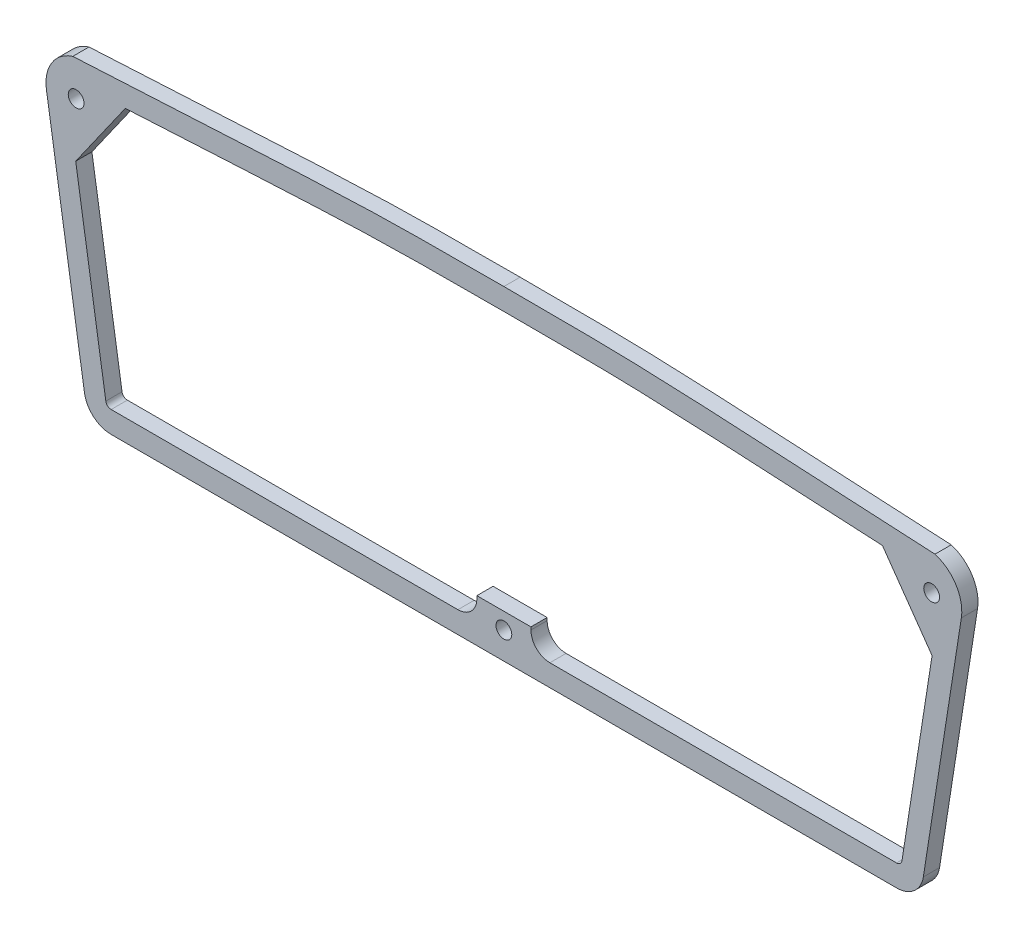
ISO-10303-21;
HEADER;
FILE_DESCRIPTION(('STEP AP214'),'2;1');
FILE_NAME('part.step','',(''),(''),'','','');
FILE_SCHEMA(('AUTOMOTIVE_DESIGN { 1 0 10303 214 1 1 1 1 }'));
ENDSEC;
DATA;
#1=APPLICATION_CONTEXT('core data for automotive mechanical design processes');
#2=APPLICATION_PROTOCOL_DEFINITION('international standard','automotive_design',2000,#1);
#3=PRODUCT_CONTEXT('',#1,'mechanical');
#4=PRODUCT('Part','Part','',(#3));
#5=PRODUCT_RELATED_PRODUCT_CATEGORY('part','',(#4));
#6=PRODUCT_DEFINITION_FORMATION('','',#4);
#7=PRODUCT_DEFINITION_CONTEXT('part definition',#1,'design');
#8=PRODUCT_DEFINITION('design','',#6,#7);
#9=PRODUCT_DEFINITION_SHAPE('','',#8);
#10=(LENGTH_UNIT() NAMED_UNIT(*) SI_UNIT(.MILLI.,.METRE.));
#11=(NAMED_UNIT(*) PLANE_ANGLE_UNIT() SI_UNIT($,.RADIAN.));
#12=(NAMED_UNIT(*) SI_UNIT($,.STERADIAN.) SOLID_ANGLE_UNIT());
#13=UNCERTAINTY_MEASURE_WITH_UNIT(LENGTH_MEASURE(1.E-05),#10,'distance_accuracy_value','');
#14=(GEOMETRIC_REPRESENTATION_CONTEXT(3) GLOBAL_UNCERTAINTY_ASSIGNED_CONTEXT((#13)) GLOBAL_UNIT_ASSIGNED_CONTEXT((#10,
#11,#12)) REPRESENTATION_CONTEXT('',''));
#15=CARTESIAN_POINT('',(0.,0.,0.));
#16=DIRECTION('',(0.,0.,1.));
#17=DIRECTION('',(1.,0.,0.));
#18=AXIS2_PLACEMENT_3D('',#15,#16,#17);
#19=CARTESIAN_POINT('',(77.6729384432531,7.59154105312176,3.));
#20=DIRECTION('',(0.,0.,-1.));
#21=DIRECTION('',(-1.,0.,0.));
#22=AXIS2_PLACEMENT_3D('',#19,#20,#21);
#23=CYLINDRICAL_SURFACE('',#22,7.);
#24=CARTESIAN_POINT('',(77.6729384432531,7.59154105312176,0.));
#25=DIRECTION('',(0.,0.,1.));
#26=DIRECTION('',(1.,0.,0.));
#27=AXIS2_PLACEMENT_3D('',#24,#25,#26);
#28=CIRCLE('',#27,7.);
#29=CARTESIAN_POINT('',(84.5890874100609,6.51131724810564,0.));
#30=VERTEX_POINT('',#29);
#31=CARTESIAN_POINT('',(79.7182282278267,14.2860753683015,0.));
#32=VERTEX_POINT('',#31);
#33=EDGE_CURVE('E472',#30,#32,#28,.T.);
#34=ORIENTED_EDGE('',*,*,#33,.T.);
#35=DIRECTION('',(0.,0.,-1.));
#36=VECTOR('',#35,1.);
#37=CARTESIAN_POINT('',(79.7182282278267,14.2860753683015,3.));
#38=LINE('',#37,#36);
#39=CARTESIAN_POINT('',(79.7182282278267,14.2860753683015,3.));
#40=VERTEX_POINT('',#39);
#41=EDGE_CURVE('E11',#40,#32,#38,.T.);
#42=ORIENTED_EDGE('',*,*,#41,.F.);
#43=CARTESIAN_POINT('',(77.6729384432531,7.59154105312176,3.));
#44=DIRECTION('',(0.,0.,1.));
#45=DIRECTION('',(1.,0.,0.));
#46=AXIS2_PLACEMENT_3D('',#43,#44,#45);
#47=CIRCLE('',#46,7.);
#48=CARTESIAN_POINT('',(84.5890874100609,6.51131724810564,3.));
#49=VERTEX_POINT('',#48);
#50=EDGE_CURVE('E299',#49,#40,#47,.T.);
#51=ORIENTED_EDGE('',*,*,#50,.F.);
#52=DIRECTION('',(0.,0.,-1.));
#53=VECTOR('',#52,1.);
#54=CARTESIAN_POINT('',(84.5890874100609,6.51131724810564,3.));
#55=LINE('',#54,#53);
#56=EDGE_CURVE('E475',#49,#30,#55,.T.);
#57=ORIENTED_EDGE('',*,*,#56,.T.);
#58=EDGE_LOOP('',(#34,#42,#51,#57));
#59=FACE_BOUND('',#58,.T.);
#60=ADVANCED_FACE('F35',(#59),#23,.T.);
#61=CARTESIAN_POINT('',(79.7182282278267,14.2860753683015,3.));
#62=CARTESIAN_POINT('',(25.,17.2860753683015,3.));
#63=CARTESIAN_POINT('',(0.,17.2860753683015,3.));
#64=(BOUNDED_CURVE() B_SPLINE_CURVE(2,(#61,#62,#63),.UNSPECIFIED.,.F.,
.F.) B_SPLINE_CURVE_WITH_KNOTS((3,3),(0.,1.),
.UNSPECIFIED.) CURVE() GEOMETRIC_REPRESENTATION_ITEM() RATIONAL_B_SPLINE_CURVE((1.,3.,1.)) REPRESENTATION_ITEM(''));
#65=DIRECTION('',(0.,0.,-1.));
#66=VECTOR('',#65,1.);
#67=SURFACE_OF_LINEAR_EXTRUSION('',#64,#66);
#68=CARTESIAN_POINT('',(79.7182282278267,14.2860753683015,0.));
#69=CARTESIAN_POINT('',(25.,17.2860753683015,0.));
#70=CARTESIAN_POINT('',(0.,17.2860753683015,0.));
#71=(BOUNDED_CURVE() B_SPLINE_CURVE(2,(#68,#69,#70),.UNSPECIFIED.,.F.,
.F.) B_SPLINE_CURVE_WITH_KNOTS((3,3),(0.,1.),
.UNSPECIFIED.) CURVE() GEOMETRIC_REPRESENTATION_ITEM() RATIONAL_B_SPLINE_CURVE((1.,3.,1.)) REPRESENTATION_ITEM(''));
#72=CARTESIAN_POINT('',(0.,17.2860753683015,0.));
#73=VERTEX_POINT('',#72);
#74=EDGE_CURVE('E478',#32,#73,#71,.T.);
#75=ORIENTED_EDGE('',*,*,#74,.T.);
#76=DIRECTION('',(0.,0.,-1.));
#77=VECTOR('',#76,1.);
#78=CARTESIAN_POINT('',(0.,17.2860753683015,3.));
#79=LINE('',#78,#77);
#80=CARTESIAN_POINT('',(0.,17.2860753683015,3.));
#81=VERTEX_POINT('',#80);
#82=EDGE_CURVE('E43',#81,#73,#79,.T.);
#83=ORIENTED_EDGE('',*,*,#82,.F.);
#84=EDGE_CURVE('E302',#40,#81,#64,.T.);
#85=ORIENTED_EDGE('',*,*,#84,.F.);
#86=ORIENTED_EDGE('',*,*,#41,.T.);
#87=EDGE_LOOP('',(#75,#83,#85,#86));
#88=FACE_BOUND('',#87,.T.);
#89=ADVANCED_FACE('F316',(#88),#67,.F.);
#90=CARTESIAN_POINT('',(-79.7182282278267,14.2860753683015,3.));
#91=CARTESIAN_POINT('',(-25.,17.2860753683015,3.));
#92=CARTESIAN_POINT('',(0.,17.2860753683015,3.));
#93=(BOUNDED_CURVE() B_SPLINE_CURVE(2,(#90,#91,#92),.UNSPECIFIED.,.F.,
.F.) B_SPLINE_CURVE_WITH_KNOTS((3,3),(0.,1.),
.UNSPECIFIED.) CURVE() GEOMETRIC_REPRESENTATION_ITEM() RATIONAL_B_SPLINE_CURVE((1.,3.,1.)) REPRESENTATION_ITEM(''));
#94=DIRECTION('',(0.,0.,-1.));
#95=VECTOR('',#94,1.);
#96=SURFACE_OF_LINEAR_EXTRUSION('',#93,#95);
#97=CARTESIAN_POINT('',(-79.7182282278267,14.2860753683015,0.));
#98=CARTESIAN_POINT('',(-25.,17.2860753683015,0.));
#99=CARTESIAN_POINT('',(0.,17.2860753683015,0.));
#100=(BOUNDED_CURVE() B_SPLINE_CURVE(2,(#97,#98,#99),.UNSPECIFIED.,.F.,
.F.) B_SPLINE_CURVE_WITH_KNOTS((3,3),(0.,1.),
.UNSPECIFIED.) CURVE() GEOMETRIC_REPRESENTATION_ITEM() RATIONAL_B_SPLINE_CURVE((1.,3.,1.)) REPRESENTATION_ITEM(''));
#101=CARTESIAN_POINT('',(-79.7182282278267,14.2860753683015,0.));
#102=VERTEX_POINT('',#101);
#103=EDGE_CURVE('E481',#102,#73,#100,.T.);
#104=ORIENTED_EDGE('',*,*,#103,.F.);
#105=DIRECTION('',(0.,0.,-1.));
#106=VECTOR('',#105,1.);
#107=CARTESIAN_POINT('',(-79.7182282278267,14.2860753683015,3.));
#108=LINE('',#107,#106);
#109=CARTESIAN_POINT('',(-79.7182282278267,14.2860753683015,3.));
#110=VERTEX_POINT('',#109);
#111=EDGE_CURVE('E526',#110,#102,#108,.T.);
#112=ORIENTED_EDGE('',*,*,#111,.F.);
#113=EDGE_CURVE('E308',#110,#81,#93,.T.);
#114=ORIENTED_EDGE('',*,*,#113,.T.);
#115=ORIENTED_EDGE('',*,*,#82,.T.);
#116=EDGE_LOOP('',(#104,#112,#114,#115));
#117=FACE_BOUND('',#116,.T.);
#118=ADVANCED_FACE('F319',(#117),#96,.T.);
#119=CARTESIAN_POINT('',(-77.6729384432531,7.59154105312176,3.));
#120=DIRECTION('',(0.,0.,-1.));
#121=DIRECTION('',(-1.,0.,0.));
#122=AXIS2_PLACEMENT_3D('',#119,#120,#121);
#123=CYLINDRICAL_SURFACE('',#122,7.);
#124=CARTESIAN_POINT('',(-77.6729384432531,7.59154105312176,0.));
#125=DIRECTION('',(0.,0.,-1.));
#126=DIRECTION('',(-1.,0.,0.));
#127=AXIS2_PLACEMENT_3D('',#124,#125,#126);
#128=CIRCLE('',#127,7.);
#129=CARTESIAN_POINT('',(-84.5890874100609,6.51131724810564,0.));
#130=VERTEX_POINT('',#129);
#131=EDGE_CURVE('E496',#130,#102,#128,.T.);
#132=ORIENTED_EDGE('',*,*,#131,.F.);
#133=DIRECTION('',(0.,0.,-1.));
#134=VECTOR('',#133,1.);
#135=CARTESIAN_POINT('',(-84.5890874100609,6.51131724810564,3.));
#136=LINE('',#135,#134);
#137=CARTESIAN_POINT('',(-84.5890874100609,6.51131724810564,3.));
#138=VERTEX_POINT('',#137);
#139=EDGE_CURVE('E524',#138,#130,#136,.T.);
#140=ORIENTED_EDGE('',*,*,#139,.F.);
#141=CARTESIAN_POINT('',(-77.6729384432531,7.59154105312176,3.));
#142=DIRECTION('',(0.,0.,-1.));
#143=DIRECTION('',(-1.,0.,0.));
#144=AXIS2_PLACEMENT_3D('',#141,#142,#143);
#145=CIRCLE('',#144,7.);
#146=EDGE_CURVE('E832',#138,#110,#145,.T.);
#147=ORIENTED_EDGE('',*,*,#146,.T.);
#148=ORIENTED_EDGE('',*,*,#111,.T.);
#149=EDGE_LOOP('',(#132,#140,#147,#148));
#150=FACE_BOUND('',#149,.T.);
#151=ADVANCED_FACE('F323',(#150),#123,.T.);
#152=CARTESIAN_POINT('',(-77.5610943048627,-38.4855130638528,3.));
#153=DIRECTION('',(-0.988021280972542,-0.154317686430875,0.));
#154=DIRECTION('',(0.154317686430875,-0.988021280972542,0.));
#155=AXIS2_PLACEMENT_3D('',#152,#153,#154);
#156=PLANE('',#155);
#157=DIRECTION('',(-0.154317686430875,0.988021280972542,0.));
#158=VECTOR('',#157,1.);
#159=CARTESIAN_POINT('',(-77.5610943048627,-38.4855130638528,0.));
#160=LINE('',#159,#158);
#161=CARTESIAN_POINT('',(-77.5610943048627,-38.4855130638528,0.));
#162=VERTEX_POINT('',#161);
#163=EDGE_CURVE('E502',#162,#130,#160,.T.);
#164=ORIENTED_EDGE('',*,*,#163,.F.);
#165=DIRECTION('',(0.,0.,-1.));
#166=VECTOR('',#165,1.);
#167=CARTESIAN_POINT('',(-77.5610943048627,-38.4855130638528,3.));
#168=LINE('',#167,#166);
#169=CARTESIAN_POINT('',(-77.5610943048627,-38.4855130638528,3.));
#170=VERTEX_POINT('',#169);
#171=EDGE_CURVE('E522',#170,#162,#168,.T.);
#172=ORIENTED_EDGE('',*,*,#171,.F.);
#173=DIRECTION('',(-0.154317686430875,0.988021280972542,0.));
#174=VECTOR('',#173,1.);
#175=CARTESIAN_POINT('',(-77.5610943048627,-38.4855130638528,3.));
#176=LINE('',#175,#174);
#177=EDGE_CURVE('E835',#170,#138,#176,.T.);
#178=ORIENTED_EDGE('',*,*,#177,.T.);
#179=ORIENTED_EDGE('',*,*,#139,.T.);
#180=EDGE_LOOP('',(#164,#172,#178,#179));
#181=FACE_BOUND('',#180,.T.);
#182=ADVANCED_FACE('F327',(#181),#156,.T.);
#183=CARTESIAN_POINT('',(-72.6209879,-37.7139246316985,3.));
#184=DIRECTION('',(0.,0.,-1.));
#185=DIRECTION('',(-1.,0.,0.));
#186=AXIS2_PLACEMENT_3D('',#183,#184,#185);
#187=CYLINDRICAL_SURFACE('',#186,5.00000000000001);
#188=CARTESIAN_POINT('',(-72.6209879,-37.7139246316985,0.));
#189=DIRECTION('',(0.,0.,1.));
#190=DIRECTION('',(1.,0.,0.));
#191=AXIS2_PLACEMENT_3D('',#188,#189,#190);
#192=CIRCLE('',#191,5.00000000000001);
#193=CARTESIAN_POINT('',(-72.6209879,-42.7139246316985,0.));
#194=VERTEX_POINT('',#193);
#195=EDGE_CURVE('E505',#162,#194,#192,.T.);
#196=ORIENTED_EDGE('',*,*,#195,.T.);
#197=DIRECTION('',(0.,0.,-1.));
#198=VECTOR('',#197,1.);
#199=CARTESIAN_POINT('',(-72.6209879,-42.7139246316985,3.));
#200=LINE('',#199,#198);
#201=CARTESIAN_POINT('',(-72.6209879,-42.7139246316985,3.));
#202=VERTEX_POINT('',#201);
#203=EDGE_CURVE('E520',#202,#194,#200,.T.);
#204=ORIENTED_EDGE('',*,*,#203,.F.);
#205=CARTESIAN_POINT('',(-72.6209879,-37.7139246316985,3.));
#206=DIRECTION('',(0.,0.,1.));
#207=DIRECTION('',(1.,0.,0.));
#208=AXIS2_PLACEMENT_3D('',#205,#206,#207);
#209=CIRCLE('',#208,5.00000000000001);
#210=EDGE_CURVE('E836',#170,#202,#209,.T.);
#211=ORIENTED_EDGE('',*,*,#210,.F.);
#212=ORIENTED_EDGE('',*,*,#171,.T.);
#213=EDGE_LOOP('',(#196,#204,#211,#212));
#214=FACE_BOUND('',#213,.T.);
#215=ADVANCED_FACE('F331',(#214),#187,.T.);
#216=CARTESIAN_POINT('',(72.6209879,-42.7139246316985,3.));
#217=DIRECTION('',(0.,-1.,0.));
#218=DIRECTION('',(0.,0.,-1.));
#219=AXIS2_PLACEMENT_3D('',#216,#217,#218);
#220=PLANE('',#219);
#221=DIRECTION('',(-1.,0.,0.));
#222=VECTOR('',#221,1.);
#223=CARTESIAN_POINT('',(72.6209879,-42.7139246316985,0.));
#224=LINE('',#223,#222);
#225=CARTESIAN_POINT('',(72.6209879,-42.7139246316985,0.));
#226=VERTEX_POINT('',#225);
#227=EDGE_CURVE('E508',#226,#194,#224,.T.);
#228=ORIENTED_EDGE('',*,*,#227,.F.);
#229=DIRECTION('',(0.,0.,-1.));
#230=VECTOR('',#229,1.);
#231=CARTESIAN_POINT('',(72.6209879,-42.7139246316985,3.));
#232=LINE('',#231,#230);
#233=CARTESIAN_POINT('',(72.6209879,-42.7139246316985,3.));
#234=VERTEX_POINT('',#233);
#235=EDGE_CURVE('E518',#234,#226,#232,.T.);
#236=ORIENTED_EDGE('',*,*,#235,.F.);
#237=DIRECTION('',(-1.,0.,0.));
#238=VECTOR('',#237,1.);
#239=CARTESIAN_POINT('',(72.6209879,-42.7139246316985,3.));
#240=LINE('',#239,#238);
#241=EDGE_CURVE('E840',#234,#202,#240,.T.);
#242=ORIENTED_EDGE('',*,*,#241,.T.);
#243=ORIENTED_EDGE('',*,*,#203,.T.);
#244=EDGE_LOOP('',(#228,#236,#242,#243));
#245=FACE_BOUND('',#244,.T.);
#246=ADVANCED_FACE('F335',(#245),#220,.T.);
#247=CARTESIAN_POINT('',(72.6209879,-37.7139246316985,3.));
#248=DIRECTION('',(0.,0.,-1.));
#249=DIRECTION('',(-1.,0.,0.));
#250=AXIS2_PLACEMENT_3D('',#247,#248,#249);
#251=CYLINDRICAL_SURFACE('',#250,5.00000000000001);
#252=CARTESIAN_POINT('',(72.6209879,-37.7139246316985,0.));
#253=DIRECTION('',(0.,0.,-1.));
#254=DIRECTION('',(-1.,0.,0.));
#255=AXIS2_PLACEMENT_3D('',#252,#253,#254);
#256=CIRCLE('',#255,5.00000000000001);
#257=CARTESIAN_POINT('',(77.5610943048627,-38.4855130638528,0.));
#258=VERTEX_POINT('',#257);
#259=EDGE_CURVE('E511',#258,#226,#256,.T.);
#260=ORIENTED_EDGE('',*,*,#259,.F.);
#261=DIRECTION('',(0.,0.,-1.));
#262=VECTOR('',#261,1.);
#263=CARTESIAN_POINT('',(77.5610943048627,-38.4855130638528,3.));
#264=LINE('',#263,#262);
#265=CARTESIAN_POINT('',(77.5610943048627,-38.4855130638528,3.));
#266=VERTEX_POINT('',#265);
#267=EDGE_CURVE('E516',#266,#258,#264,.T.);
#268=ORIENTED_EDGE('',*,*,#267,.F.);
#269=CARTESIAN_POINT('',(72.6209879,-37.7139246316985,3.));
#270=DIRECTION('',(0.,0.,-1.));
#271=DIRECTION('',(-1.,0.,0.));
#272=AXIS2_PLACEMENT_3D('',#269,#270,#271);
#273=CIRCLE('',#272,5.00000000000001);
#274=EDGE_CURVE('E842',#266,#234,#273,.T.);
#275=ORIENTED_EDGE('',*,*,#274,.T.);
#276=ORIENTED_EDGE('',*,*,#235,.T.);
#277=EDGE_LOOP('',(#260,#268,#275,#276));
#278=FACE_BOUND('',#277,.T.);
#279=ADVANCED_FACE('F339',(#278),#251,.T.);
#280=CARTESIAN_POINT('',(77.5610943048627,-38.4855130638528,3.));
#281=DIRECTION('',(-0.988021280972542,0.154317686430875,0.));
#282=DIRECTION('',(-0.154317686430875,-0.988021280972542,0.));
#283=AXIS2_PLACEMENT_3D('',#280,#281,#282);
#284=PLANE('',#283);
#285=DIRECTION('',(0.154317686430875,0.988021280972542,0.));
#286=VECTOR('',#285,1.);
#287=CARTESIAN_POINT('',(77.5610943048627,-38.4855130638528,0.));
#288=LINE('',#287,#286);
#289=EDGE_CURVE('E303',#258,#30,#288,.T.);
#290=ORIENTED_EDGE('',*,*,#289,.T.);
#291=ORIENTED_EDGE('',*,*,#56,.F.);
#292=DIRECTION('',(0.154317686430875,0.988021280972542,0.));
#293=VECTOR('',#292,1.);
#294=CARTESIAN_POINT('',(77.5610943048627,-38.4855130638528,3.));
#295=LINE('',#294,#293);
#296=EDGE_CURVE('E484',#266,#49,#295,.T.);
#297=ORIENTED_EDGE('',*,*,#296,.F.);
#298=ORIENTED_EDGE('',*,*,#267,.T.);
#299=EDGE_LOOP('',(#290,#291,#297,#298));
#300=FACE_BOUND('',#299,.T.);
#301=ADVANCED_FACE('F343',(#300),#284,.F.);
#302=CARTESIAN_POINT('',(77.6729384432531,7.59154105312176,3.));
#303=DIRECTION('',(0.,0.,1.));
#304=DIRECTION('',(1.,0.,0.));
#305=AXIS2_PLACEMENT_3D('',#302,#303,#304);
#306=PLANE('',#305);
#307=CARTESIAN_POINT('',(0.,-37.7139246316985,3.));
#308=DIRECTION('',(0.,0.,1.));
#309=DIRECTION('',(1.,0.,0.));
#310=AXIS2_PLACEMENT_3D('',#307,#308,#309);
#311=CIRCLE('',#310,1.46049999999999);
#312=CARTESIAN_POINT('',(1.46049999999999,-37.7139246316985,3.));
#313=VERTEX_POINT('',#312);
#314=EDGE_CURVE('E748',#313,#313,#311,.T.);
#315=ORIENTED_EDGE('',*,*,#314,.F.);
#316=EDGE_LOOP('',(#315));
#317=FACE_BOUND('',#316,.T.);
#318=CARTESIAN_POINT('',(79.0964854550654,7.80060452720227,3.));
#319=DIRECTION('',(0.,0.,1.));
#320=DIRECTION('',(1.,0.,0.));
#321=AXIS2_PLACEMENT_3D('',#318,#319,#320);
#322=CIRCLE('',#321,1.4605);
#323=CARTESIAN_POINT('',(80.5569854550654,7.80060452720227,3.));
#324=VERTEX_POINT('',#323);
#325=EDGE_CURVE('E757',#324,#324,#322,.T.);
#326=ORIENTED_EDGE('',*,*,#325,.F.);
#327=EDGE_LOOP('',(#326));
#328=FACE_BOUND('',#327,.T.);
#329=CARTESIAN_POINT('',(-79.0964854551997,7.80060452720227,3.));
#330=DIRECTION('',(0.,0.,1.));
#331=DIRECTION('',(1.,0.,0.));
#332=AXIS2_PLACEMENT_3D('',#329,#330,#331);
#333=CIRCLE('',#332,1.4605);
#334=CARTESIAN_POINT('',(-77.6359854551997,7.80060452720227,3.));
#335=VERTEX_POINT('',#334);
#336=EDGE_CURVE('E38',#335,#335,#333,.T.);
#337=ORIENTED_EDGE('',*,*,#336,.F.);
#338=EDGE_LOOP('',(#337));
#339=FACE_BOUND('',#338,.T.);
#340=DIRECTION('',(-0.154317686423607,-0.988021280973677,0.));
#341=VECTOR('',#340,1.);
#342=CARTESIAN_POINT('',(79.1760753720976,-2.2250182853252,3.));
#343=LINE('',#342,#341);
#344=CARTESIAN_POINT('',(79.1760753720976,-2.2250182853252,3.));
#345=VERTEX_POINT('',#344);
#346=CARTESIAN_POINT('',(73.6090091809725,-37.8682423181294,3.));
#347=VERTEX_POINT('',#346);
#348=EDGE_CURVE('E199',#345,#347,#343,.T.);
#349=ORIENTED_EDGE('',*,*,#348,.T.);
#350=CARTESIAN_POINT('',(72.6209879,-37.7139246316985,3.));
#351=DIRECTION('',(0.,0.,-1.));
#352=DIRECTION('',(-1.,0.,0.));
#353=AXIS2_PLACEMENT_3D('',#350,#351,#352);
#354=CIRCLE('',#353,1.00000000000001);
#355=CARTESIAN_POINT('',(72.6209879,-38.7139246316985,3.));
#356=VERTEX_POINT('',#355);
#357=EDGE_CURVE('E208',#347,#356,#354,.T.);
#358=ORIENTED_EDGE('',*,*,#357,.T.);
#359=DIRECTION('',(-1.,0.,0.));
#360=VECTOR('',#359,1.);
#361=CARTESIAN_POINT('',(72.6209879,-38.7139246316985,3.));
#362=LINE('',#361,#360);
#363=CARTESIAN_POINT('',(8.49999999986572,-38.7139246316985,3.));
#364=VERTEX_POINT('',#363);
#365=EDGE_CURVE('E51',#356,#364,#362,.T.);
#366=ORIENTED_EDGE('',*,*,#365,.T.);
#367=CARTESIAN_POINT('',(8.49999999986572,-35.2139246316985,3.));
#368=DIRECTION('',(0.,0.,-1.));
#369=DIRECTION('',(1.,0.,0.));
#370=AXIS2_PLACEMENT_3D('',#367,#368,#369);
#371=CIRCLE('',#370,3.5);
#372=CARTESIAN_POINT('',(4.99999999986572,-35.2139246316985,3.));
#373=VERTEX_POINT('',#372);
#374=EDGE_CURVE('E226',#364,#373,#371,.T.);
#375=ORIENTED_EDGE('',*,*,#374,.T.);
#376=DIRECTION('',(0.,1.,0.));
#377=VECTOR('',#376,1.);
#378=CARTESIAN_POINT('',(4.99999999986572,-34.7139246316985,3.));
#379=LINE('',#378,#377);
#380=CARTESIAN_POINT('',(4.99999999986572,-34.7139246316985,3.));
#381=VERTEX_POINT('',#380);
#382=EDGE_CURVE('E229',#373,#381,#379,.T.);
#383=ORIENTED_EDGE('',*,*,#382,.T.);
#384=DIRECTION('',(-1.,0.,0.));
#385=VECTOR('',#384,1.);
#386=CARTESIAN_POINT('',(-5.00000000013424,-34.7139246316985,3.));
#387=LINE('',#386,#385);
#388=CARTESIAN_POINT('',(-5.00000000013424,-34.7139246316985,3.));
#389=VERTEX_POINT('',#388);
#390=EDGE_CURVE('E232',#381,#389,#387,.T.);
#391=ORIENTED_EDGE('',*,*,#390,.T.);
#392=DIRECTION('',(0.,-1.,0.));
#393=VECTOR('',#392,1.);
#394=CARTESIAN_POINT('',(-5.00000000013424,-34.7139246316985,3.));
#395=LINE('',#394,#393);
#396=CARTESIAN_POINT('',(-5.00000000013424,-35.2139246316985,3.));
#397=VERTEX_POINT('',#396);
#398=EDGE_CURVE('E235',#389,#397,#395,.T.);
#399=ORIENTED_EDGE('',*,*,#398,.T.);
#400=CARTESIAN_POINT('',(-8.50000000013424,-35.2139246316985,3.));
#401=DIRECTION('',(0.,0.,-1.));
#402=DIRECTION('',(1.,0.,0.));
#403=AXIS2_PLACEMENT_3D('',#400,#401,#402);
#404=CIRCLE('',#403,3.50000000000001);
#405=CARTESIAN_POINT('',(-8.50000000013424,-38.7139246316985,3.));
#406=VERTEX_POINT('',#405);
#407=EDGE_CURVE('E238',#397,#406,#404,.T.);
#408=ORIENTED_EDGE('',*,*,#407,.T.);
#409=DIRECTION('',(-1.,0.,0.));
#410=VECTOR('',#409,1.);
#411=CARTESIAN_POINT('',(-8.50000000013424,-38.7139246316985,3.));
#412=LINE('',#411,#410);
#413=CARTESIAN_POINT('',(-72.6209879,-38.7139246316985,3.));
#414=VERTEX_POINT('',#413);
#415=EDGE_CURVE('E241',#406,#414,#412,.T.);
#416=ORIENTED_EDGE('',*,*,#415,.T.);
#417=CARTESIAN_POINT('',(-72.6209879,-37.7139246316985,3.));
#418=DIRECTION('',(0.,0.,-1.));
#419=DIRECTION('',(-1.,0.,0.));
#420=AXIS2_PLACEMENT_3D('',#417,#418,#419);
#421=CIRCLE('',#420,1.);
#422=CARTESIAN_POINT('',(-73.6090091809725,-37.8682423181294,3.));
#423=VERTEX_POINT('',#422);
#424=EDGE_CURVE('E244',#414,#423,#421,.T.);
#425=ORIENTED_EDGE('',*,*,#424,.T.);
#426=DIRECTION('',(-0.154317686430876,0.988021280972541,0.));
#427=VECTOR('',#426,1.);
#428=CARTESIAN_POINT('',(-73.6090091809725,-37.8682423181294,3.));
#429=LINE('',#428,#427);
#430=CARTESIAN_POINT('',(-79.1760753723663,-2.2250182853252,3.));
#431=VERTEX_POINT('',#430);
#432=EDGE_CURVE('E247',#423,#431,#429,.T.);
#433=ORIENTED_EDGE('',*,*,#432,.T.);
#434=DIRECTION('',(0.575583800609477,0.8177428009319,0.));
#435=VECTOR('',#434,1.);
#436=CARTESIAN_POINT('',(-79.1760753723663,-2.2250182853252,3.));
#437=LINE('',#436,#435);
#438=CARTESIAN_POINT('',(-70.0000000001343,10.8116056928091,3.));
#439=VERTEX_POINT('',#438);
#440=EDGE_CURVE('E250',#431,#439,#437,.T.);
#441=ORIENTED_EDGE('',*,*,#440,.T.);
#442=CARTESIAN_POINT('',(0.,13.2860753683015,3.));
#443=CARTESIAN_POINT('',(-3.29107209473179,13.2860753683015,3.));
#444=CARTESIAN_POINT('',(-6.58212193717807,13.2824882871999,3.));
#445=CARTESIAN_POINT('',(-13.1640753899625,13.2517414258694,3.));
#446=CARTESIAN_POINT('',(-16.454979754706,13.2247032562146,3.));
#447=CARTESIAN_POINT('',(-23.0363678069169,13.1028135003583,3.));
#448=CARTESIAN_POINT('',(-26.3256197066154,13.0030932681781,3.));
#449=CARTESIAN_POINT('',(-32.9018828371461,12.7438223133161,3.));
#450=CARTESIAN_POINT('',(-36.1890813609105,12.5892049470962,3.));
#451=CARTESIAN_POINT('',(-46.049858240577,12.1034326410724,3.));
#452=CARTESIAN_POINT('',(-52.6222014318515,11.7512775449594,3.));
#453=CARTESIAN_POINT('',(-62.796370303681,11.2034283516205,3.));
#454=CARTESIAN_POINT('',(-66.3982090093153,11.0079643881922,3.));
#455=CARTESIAN_POINT('',(-70.0000000001343,10.8116056928091,3.));
#456=B_SPLINE_CURVE_WITH_KNOTS('',3,(#442,#443,#444,#445,#446,#447,#448,#449,#450,#451,#452,
#453,#454,#455),.UNSPECIFIED.,.F.,.F.,(4,2,2,2,2,2,4),(0.112987579410559,0.237987579410559,
0.362987579410559,0.487987579410559,0.612987579410559,0.862987579410559,1.),.UNSPECIFIED.);
#457=CARTESIAN_POINT('',(0.,13.2860753683015,3.));
#458=VERTEX_POINT('',#457);
#459=EDGE_CURVE('E375',#439,#458,#456,.F.);
#460=ORIENTED_EDGE('',*,*,#459,.T.);
#461=CARTESIAN_POINT('',(69.9999999998657,10.8116056928091,3.));
#462=CARTESIAN_POINT('',(66.3982091875061,11.0079643784577,3.));
#463=CARTESIAN_POINT('',(62.7963706644107,11.2034283320237,3.));
#464=CARTESIAN_POINT('',(52.6222021826436,11.7512775048464,3.));
#465=CARTESIAN_POINT('',(46.0498599502777,12.1034325522592,3.));
#466=CARTESIAN_POINT('',(36.189082450543,12.5892048957115,3.));
#467=CARTESIAN_POINT('',(32.9018823924642,12.7438223291049,3.));
#468=CARTESIAN_POINT('',(26.3256208028188,13.0030932267028,3.));
#469=CARTESIAN_POINT('',(23.0363744269811,13.1028133204088,3.));
#470=CARTESIAN_POINT('',(16.454989724662,13.2247031289106,3.));
#471=CARTESIAN_POINT('',(13.1640799797589,13.2517413958912,3.));
#472=CARTESIAN_POINT('',(6.58212395955352,13.2824882862901,3.));
#473=CARTESIAN_POINT('',(3.29107306991786,13.2860753683015,3.));
#474=CARTESIAN_POINT('',(0.,13.2860753683015,3.));
#475=B_SPLINE_CURVE_WITH_KNOTS('',3,(#461,#462,#463,#464,#465,#466,#467,#468,#469,#470,#471,
#472,#473,#474),.UNSPECIFIED.,.F.,.F.,(4,2,2,2,2,2,4),(0.,0.137012417566287,0.387012417566287,
0.512012417566287,0.637012417566287,0.762012417566287,0.887012417566287),.UNSPECIFIED.);
#476=CARTESIAN_POINT('',(69.9999999998657,10.8116056928091,3.));
#477=VERTEX_POINT('',#476);
#478=EDGE_CURVE('E385',#458,#477,#475,.F.);
#479=ORIENTED_EDGE('',*,*,#478,.T.);
#480=DIRECTION('',(0.575583800609477,-0.8177428009319,0.));
#481=VECTOR('',#480,1.);
#482=CARTESIAN_POINT('',(79.1760753720976,-2.2250182853252,3.));
#483=LINE('',#482,#481);
#484=EDGE_CURVE('E205',#477,#345,#483,.T.);
#485=ORIENTED_EDGE('',*,*,#484,.T.);
#486=EDGE_LOOP('',(#349,#358,#366,#375,#383,#391,#399,#408,#416,#425,#433,#441,#460,#479,#485));
#487=FACE_BOUND('',#486,.T.);
#488=ORIENTED_EDGE('',*,*,#50,.T.);
#489=ORIENTED_EDGE('',*,*,#84,.T.);
#490=ORIENTED_EDGE('',*,*,#113,.F.);
#491=ORIENTED_EDGE('',*,*,#146,.F.);
#492=ORIENTED_EDGE('',*,*,#177,.F.);
#493=ORIENTED_EDGE('',*,*,#210,.T.);
#494=ORIENTED_EDGE('',*,*,#241,.F.);
#495=ORIENTED_EDGE('',*,*,#274,.F.);
#496=ORIENTED_EDGE('',*,*,#296,.T.);
#497=EDGE_LOOP('',(#488,#489,#490,#491,#492,#493,#494,#495,#496));
#498=FACE_BOUND('',#497,.T.);
#499=ADVANCED_FACE('F212',(#317,#328,#339,#487,#498),#306,.T.);
#500=CARTESIAN_POINT('',(77.6729384432531,7.59154105312176,0.));
#501=DIRECTION('',(0.,0.,1.));
#502=DIRECTION('',(1.,0.,0.));
#503=AXIS2_PLACEMENT_3D('',#500,#501,#502);
#504=PLANE('',#503);
#505=CARTESIAN_POINT('',(0.,-37.7139246316985,0.));
#506=DIRECTION('',(0.,0.,-1.));
#507=DIRECTION('',(-1.,0.,0.));
#508=AXIS2_PLACEMENT_3D('',#505,#506,#507);
#509=CIRCLE('',#508,1.46049999999999);
#510=CARTESIAN_POINT('',(-1.46049999999999,-37.7139246316985,0.));
#511=VERTEX_POINT('',#510);
#512=EDGE_CURVE('E751',#511,#511,#509,.T.);
#513=ORIENTED_EDGE('',*,*,#512,.F.);
#514=EDGE_LOOP('',(#513));
#515=FACE_BOUND('',#514,.T.);
#516=CARTESIAN_POINT('',(79.0964854550654,7.80060452720227,0.));
#517=DIRECTION('',(0.,0.,-1.));
#518=DIRECTION('',(-1.,0.,0.));
#519=AXIS2_PLACEMENT_3D('',#516,#517,#518);
#520=CIRCLE('',#519,1.46049999999999);
#521=CARTESIAN_POINT('',(77.6359854550654,7.80060452720227,0.));
#522=VERTEX_POINT('',#521);
#523=EDGE_CURVE('E753',#522,#522,#520,.T.);
#524=ORIENTED_EDGE('',*,*,#523,.F.);
#525=EDGE_LOOP('',(#524));
#526=FACE_BOUND('',#525,.T.);
#527=CARTESIAN_POINT('',(-79.0964854551997,7.80060452720227,0.));
#528=DIRECTION('',(0.,0.,-1.));
#529=DIRECTION('',(-1.,0.,0.));
#530=AXIS2_PLACEMENT_3D('',#527,#528,#529);
#531=CIRCLE('',#530,1.46049999999999);
#532=CARTESIAN_POINT('',(-80.5569854551997,7.80060452720227,0.));
#533=VERTEX_POINT('',#532);
#534=EDGE_CURVE('E222',#533,#533,#531,.T.);
#535=ORIENTED_EDGE('',*,*,#534,.F.);
#536=EDGE_LOOP('',(#535));
#537=FACE_BOUND('',#536,.T.);
#538=CARTESIAN_POINT('',(72.6209879,-37.7139246316985,0.));
#539=DIRECTION('',(0.,0.,-1.));
#540=DIRECTION('',(-1.,0.,0.));
#541=AXIS2_PLACEMENT_3D('',#538,#539,#540);
#542=CIRCLE('',#541,1.00000000000001);
#543=CARTESIAN_POINT('',(73.6090091809725,-37.8682423181294,0.));
#544=VERTEX_POINT('',#543);
#545=CARTESIAN_POINT('',(72.6209879,-38.7139246316985,0.));
#546=VERTEX_POINT('',#545);
#547=EDGE_CURVE('E532',#544,#546,#542,.T.);
#548=ORIENTED_EDGE('',*,*,#547,.F.);
#549=DIRECTION('',(-0.154317686423607,-0.988021280973677,0.));
#550=VECTOR('',#549,1.);
#551=CARTESIAN_POINT('',(79.1760753720976,-2.2250182853252,0.));
#552=LINE('',#551,#550);
#553=CARTESIAN_POINT('',(79.1760753720976,-2.2250182853252,0.));
#554=VERTEX_POINT('',#553);
#555=EDGE_CURVE('E59',#554,#544,#552,.T.);
#556=ORIENTED_EDGE('',*,*,#555,.F.);
#557=DIRECTION('',(0.575583800609477,-0.8177428009319,0.));
#558=VECTOR('',#557,1.);
#559=CARTESIAN_POINT('',(79.1760753720976,-2.2250182853252,0.));
#560=LINE('',#559,#558);
#561=CARTESIAN_POINT('',(69.9999999998657,10.8116056928091,0.));
#562=VERTEX_POINT('',#561);
#563=EDGE_CURVE('E216',#562,#554,#560,.T.);
#564=ORIENTED_EDGE('',*,*,#563,.F.);
#565=CARTESIAN_POINT('',(0.,13.2860753683015,0.));
#566=CARTESIAN_POINT('',(3.29107306991786,13.2860753683015,0.));
#567=CARTESIAN_POINT('',(6.58212395955352,13.2824882862901,0.));
#568=CARTESIAN_POINT('',(13.1640799797589,13.2517413958912,0.));
#569=CARTESIAN_POINT('',(16.454989724662,13.2247031289106,0.));
#570=CARTESIAN_POINT('',(23.0363744269811,13.1028133204088,0.));
#571=CARTESIAN_POINT('',(26.3256208028188,13.0030932267028,0.));
#572=CARTESIAN_POINT('',(32.9018823924642,12.7438223291049,0.));
#573=CARTESIAN_POINT('',(36.189082450543,12.5892048957115,0.));
#574=CARTESIAN_POINT('',(46.0498599502777,12.1034325522592,0.));
#575=CARTESIAN_POINT('',(52.6222021826436,11.7512775048464,0.));
#576=CARTESIAN_POINT('',(62.7963706644107,11.2034283320237,0.));
#577=CARTESIAN_POINT('',(66.3982091875061,11.0079643784577,0.));
#578=CARTESIAN_POINT('',(69.9999999998657,10.8116056928091,0.));
#579=B_SPLINE_CURVE_WITH_KNOTS('',3,(#565,#566,#567,#568,#569,#570,#571,#572,#573,#574,#575,
#576,#577,#578),.UNSPECIFIED.,.F.,.F.,(4,2,2,2,2,2,4),(0.,0.125,0.25,0.375,0.5,0.75,
0.887012417566287),.UNSPECIFIED.);
#580=CARTESIAN_POINT('',(0.,13.2860753683015,0.));
#581=VERTEX_POINT('',#580);
#582=EDGE_CURVE('E219',#581,#562,#579,.T.);
#583=ORIENTED_EDGE('',*,*,#582,.F.);
#584=CARTESIAN_POINT('',(-70.0000000001343,10.8116056928091,0.));
#585=CARTESIAN_POINT('',(-66.3982090093153,11.0079643881922,0.));
#586=CARTESIAN_POINT('',(-62.796370303681,11.2034283516205,0.));
#587=CARTESIAN_POINT('',(-52.6222014318515,11.7512775449594,0.));
#588=CARTESIAN_POINT('',(-46.049858240577,12.1034326410724,0.));
#589=CARTESIAN_POINT('',(-36.1890813609105,12.5892049470962,0.));
#590=CARTESIAN_POINT('',(-32.9018828371461,12.7438223133161,0.));
#591=CARTESIAN_POINT('',(-26.3256197066154,13.0030932681781,0.));
#592=CARTESIAN_POINT('',(-23.0363678069169,13.1028135003583,0.));
#593=CARTESIAN_POINT('',(-16.454979754706,13.2247032562146,0.));
#594=CARTESIAN_POINT('',(-13.1640753899625,13.2517414258694,0.));
#595=CARTESIAN_POINT('',(-6.58212193717807,13.2824882871999,0.));
#596=CARTESIAN_POINT('',(-3.29107209473179,13.2860753683015,0.));
#597=CARTESIAN_POINT('',(0.,13.2860753683015,0.));
#598=B_SPLINE_CURVE_WITH_KNOTS('',3,(#584,#585,#586,#587,#588,#589,#590,#591,#592,#593,#594,
#595,#596,#597),.UNSPECIFIED.,.F.,.F.,(4,2,2,2,2,2,4),(0.112987579410559,0.25,0.5,0.625,0.75,
0.875,1.),.UNSPECIFIED.);
#599=CARTESIAN_POINT('',(-70.0000000001343,10.8116056928091,0.));
#600=VERTEX_POINT('',#599);
#601=EDGE_CURVE('E295',#600,#581,#598,.T.);
#602=ORIENTED_EDGE('',*,*,#601,.F.);
#603=DIRECTION('',(0.575583800609477,0.8177428009319,0.));
#604=VECTOR('',#603,1.);
#605=CARTESIAN_POINT('',(-79.1760753723663,-2.2250182853252,0.));
#606=LINE('',#605,#604);
#607=CARTESIAN_POINT('',(-79.1760753723663,-2.2250182853252,0.));
#608=VERTEX_POINT('',#607);
#609=EDGE_CURVE('E287',#608,#600,#606,.T.);
#610=ORIENTED_EDGE('',*,*,#609,.F.);
#611=DIRECTION('',(-0.154317686430876,0.988021280972541,0.));
#612=VECTOR('',#611,1.);
#613=CARTESIAN_POINT('',(-73.6090091809725,-37.8682423181294,0.));
#614=LINE('',#613,#612);
#615=CARTESIAN_POINT('',(-73.6090091809725,-37.8682423181294,0.));
#616=VERTEX_POINT('',#615);
#617=EDGE_CURVE('E296',#616,#608,#614,.T.);
#618=ORIENTED_EDGE('',*,*,#617,.F.);
#619=CARTESIAN_POINT('',(-72.6209879,-37.7139246316985,0.));
#620=DIRECTION('',(0.,0.,-1.));
#621=DIRECTION('',(-1.,0.,0.));
#622=AXIS2_PLACEMENT_3D('',#619,#620,#621);
#623=CIRCLE('',#622,1.);
#624=CARTESIAN_POINT('',(-72.6209879,-38.7139246316985,0.));
#625=VERTEX_POINT('',#624);
#626=EDGE_CURVE('E557',#625,#616,#623,.T.);
#627=ORIENTED_EDGE('',*,*,#626,.F.);
#628=DIRECTION('',(-1.,0.,0.));
#629=VECTOR('',#628,1.);
#630=CARTESIAN_POINT('',(-8.50000000013424,-38.7139246316985,0.));
#631=LINE('',#630,#629);
#632=CARTESIAN_POINT('',(-8.50000000013424,-38.7139246316985,0.));
#633=VERTEX_POINT('',#632);
#634=EDGE_CURVE('E554',#633,#625,#631,.T.);
#635=ORIENTED_EDGE('',*,*,#634,.F.);
#636=CARTESIAN_POINT('',(-8.50000000013424,-35.2139246316985,0.));
#637=DIRECTION('',(0.,0.,-1.));
#638=DIRECTION('',(1.,0.,0.));
#639=AXIS2_PLACEMENT_3D('',#636,#637,#638);
#640=CIRCLE('',#639,3.50000000000001);
#641=CARTESIAN_POINT('',(-5.00000000013424,-35.2139246316985,0.));
#642=VERTEX_POINT('',#641);
#643=EDGE_CURVE('E551',#642,#633,#640,.T.);
#644=ORIENTED_EDGE('',*,*,#643,.F.);
#645=DIRECTION('',(0.,-1.,0.));
#646=VECTOR('',#645,1.);
#647=CARTESIAN_POINT('',(-5.00000000013424,-34.7139246316985,0.));
#648=LINE('',#647,#646);
#649=CARTESIAN_POINT('',(-5.00000000013424,-34.7139246316985,0.));
#650=VERTEX_POINT('',#649);
#651=EDGE_CURVE('E548',#650,#642,#648,.T.);
#652=ORIENTED_EDGE('',*,*,#651,.F.);
#653=DIRECTION('',(-1.,0.,0.));
#654=VECTOR('',#653,1.);
#655=CARTESIAN_POINT('',(-5.00000000013424,-34.7139246316985,0.));
#656=LINE('',#655,#654);
#657=CARTESIAN_POINT('',(4.99999999986572,-34.7139246316985,0.));
#658=VERTEX_POINT('',#657);
#659=EDGE_CURVE('E545',#658,#650,#656,.T.);
#660=ORIENTED_EDGE('',*,*,#659,.F.);
#661=DIRECTION('',(0.,1.,0.));
#662=VECTOR('',#661,1.);
#663=CARTESIAN_POINT('',(4.99999999986572,-34.7139246316985,0.));
#664=LINE('',#663,#662);
#665=CARTESIAN_POINT('',(4.99999999986572,-35.2139246316985,0.));
#666=VERTEX_POINT('',#665);
#667=EDGE_CURVE('E542',#666,#658,#664,.T.);
#668=ORIENTED_EDGE('',*,*,#667,.F.);
#669=CARTESIAN_POINT('',(8.49999999986572,-35.2139246316985,0.));
#670=DIRECTION('',(0.,0.,-1.));
#671=DIRECTION('',(1.,0.,0.));
#672=AXIS2_PLACEMENT_3D('',#669,#670,#671);
#673=CIRCLE('',#672,3.5);
#674=CARTESIAN_POINT('',(8.49999999986572,-38.7139246316985,0.));
#675=VERTEX_POINT('',#674);
#676=EDGE_CURVE('E539',#675,#666,#673,.T.);
#677=ORIENTED_EDGE('',*,*,#676,.F.);
#678=DIRECTION('',(-1.,0.,0.));
#679=VECTOR('',#678,1.);
#680=CARTESIAN_POINT('',(72.6209879,-38.7139246316985,0.));
#681=LINE('',#680,#679);
#682=EDGE_CURVE('E533',#546,#675,#681,.T.);
#683=ORIENTED_EDGE('',*,*,#682,.F.);
#684=EDGE_LOOP('',(#548,#556,#564,#583,#602,#610,#618,#627,#635,#644,#652,#660,#668,#677,#683));
#685=FACE_BOUND('',#684,.T.);
#686=ORIENTED_EDGE('',*,*,#33,.F.);
#687=ORIENTED_EDGE('',*,*,#289,.F.);
#688=ORIENTED_EDGE('',*,*,#259,.T.);
#689=ORIENTED_EDGE('',*,*,#227,.T.);
#690=ORIENTED_EDGE('',*,*,#195,.F.);
#691=ORIENTED_EDGE('',*,*,#163,.T.);
#692=ORIENTED_EDGE('',*,*,#131,.T.);
#693=ORIENTED_EDGE('',*,*,#103,.T.);
#694=ORIENTED_EDGE('',*,*,#74,.F.);
#695=EDGE_LOOP('',(#686,#687,#688,#689,#690,#691,#692,#693,#694));
#696=FACE_BOUND('',#695,.T.);
#697=ADVANCED_FACE('F348',(#515,#526,#537,#685,#696),#504,.F.);
#698=CARTESIAN_POINT('',(79.1760753720976,-2.2250182853252,3.));
#699=DIRECTION('',(0.988021280973677,-0.154317686423607,0.));
#700=DIRECTION('',(0.154317686423607,0.988021280973677,0.));
#701=AXIS2_PLACEMENT_3D('',#698,#699,#700);
#702=PLANE('',#701);
#703=ORIENTED_EDGE('',*,*,#555,.T.);
#704=DIRECTION('',(0.,0.,-1.));
#705=VECTOR('',#704,1.);
#706=CARTESIAN_POINT('',(73.6090091809725,-37.8682423181294,3.));
#707=LINE('',#706,#705);
#708=EDGE_CURVE('E195',#347,#544,#707,.T.);
#709=ORIENTED_EDGE('',*,*,#708,.F.);
#710=ORIENTED_EDGE('',*,*,#348,.F.);
#711=DIRECTION('',(0.,0.,-1.));
#712=VECTOR('',#711,1.);
#713=CARTESIAN_POINT('',(79.1760753720976,-2.2250182853252,3.));
#714=LINE('',#713,#712);
#715=EDGE_CURVE('E413',#345,#554,#714,.T.);
#716=ORIENTED_EDGE('',*,*,#715,.T.);
#717=EDGE_LOOP('',(#703,#709,#710,#716));
#718=FACE_BOUND('',#717,.T.);
#719=ADVANCED_FACE('F197',(#718),#702,.F.);
#720=CARTESIAN_POINT('',(79.1760753720976,-2.2250182853252,3.));
#721=DIRECTION('',(0.8177428009319,0.575583800609477,0.));
#722=DIRECTION('',(-0.575583800609477,0.8177428009319,0.));
#723=AXIS2_PLACEMENT_3D('',#720,#721,#722);
#724=PLANE('',#723);
#725=ORIENTED_EDGE('',*,*,#563,.T.);
#726=ORIENTED_EDGE('',*,*,#715,.F.);
#727=ORIENTED_EDGE('',*,*,#484,.F.);
#728=DIRECTION('',(0.,0.,-1.));
#729=VECTOR('',#728,1.);
#730=CARTESIAN_POINT('',(69.9999999998657,10.8116056928091,3.));
#731=LINE('',#730,#729);
#732=EDGE_CURVE('E404',#477,#562,#731,.T.);
#733=ORIENTED_EDGE('',*,*,#732,.T.);
#734=EDGE_LOOP('',(#725,#726,#727,#733));
#735=FACE_BOUND('',#734,.T.);
#736=ADVANCED_FACE('F459',(#735),#724,.F.);
#737=CARTESIAN_POINT('',(0.,13.2860753683015,3.));
#738=CARTESIAN_POINT('',(3.29107306991786,13.2860753683015,3.));
#739=CARTESIAN_POINT('',(6.58212395955352,13.2824882862901,3.));
#740=CARTESIAN_POINT('',(13.1640799797589,13.2517413958912,3.));
#741=CARTESIAN_POINT('',(16.454989724662,13.2247031289106,3.));
#742=CARTESIAN_POINT('',(23.0363744269811,13.1028133204088,3.));
#743=CARTESIAN_POINT('',(26.3256208028188,13.0030932267028,3.));
#744=CARTESIAN_POINT('',(32.9018823924642,12.7438223291049,3.));
#745=CARTESIAN_POINT('',(36.189082450543,12.5892048957115,3.));
#746=CARTESIAN_POINT('',(46.0498599502777,12.1034325522592,3.));
#747=CARTESIAN_POINT('',(52.6222021826436,11.7512775048464,3.));
#748=CARTESIAN_POINT('',(65.7667009376797,11.0434847468415,3.));
#749=CARTESIAN_POINT('',(72.338682031898,10.6845571799684,3.));
#750=CARTESIAN_POINT('',(78.9105945278256,10.3243431711558,3.));
#751=B_SPLINE_CURVE_WITH_KNOTS('',3,(#737,#738,#739,#740,#741,#742,#743,#744,#745,#746,#747,
#748,#749,#750),.UNSPECIFIED.,.F.,.F.,(4,2,2,2,2,2,4),(0.,0.125,0.25,0.375,0.5,0.75,1.),.UNSPECIFIED.);
#752=DIRECTION('',(0.,0.,-1.));
#753=VECTOR('',#752,1.);
#754=SURFACE_OF_LINEAR_EXTRUSION('',#751,#753);
#755=ORIENTED_EDGE('',*,*,#582,.T.);
#756=ORIENTED_EDGE('',*,*,#732,.F.);
#757=ORIENTED_EDGE('',*,*,#478,.F.);
#758=DIRECTION('',(0.,0.,-1.));
#759=VECTOR('',#758,1.);
#760=CARTESIAN_POINT('',(0.,13.2860753683015,3.));
#761=LINE('',#760,#759);
#762=EDGE_CURVE('E402',#458,#581,#761,.T.);
#763=ORIENTED_EDGE('',*,*,#762,.T.);
#764=EDGE_LOOP('',(#755,#756,#757,#763));
#765=FACE_BOUND('',#764,.T.);
#766=ADVANCED_FACE('F269',(#765),#754,.F.);
#767=CARTESIAN_POINT('',(-78.9105945278263,10.3243431711574,3.));
#768=CARTESIAN_POINT('',(-72.3386818600629,10.6845571893885,3.));
#769=CARTESIAN_POINT('',(-65.7667005881494,11.0434847659777,3.));
#770=CARTESIAN_POINT('',(-52.6222014318515,11.7512775449594,3.));
#771=CARTESIAN_POINT('',(-46.049858240577,12.1034326410724,3.));
#772=CARTESIAN_POINT('',(-36.1890813609105,12.5892049470962,3.));
#773=CARTESIAN_POINT('',(-32.9018828371461,12.7438223133161,3.));
#774=CARTESIAN_POINT('',(-26.3256197066154,13.0030932681781,3.));
#775=CARTESIAN_POINT('',(-23.0363678069169,13.1028135003583,3.));
#776=CARTESIAN_POINT('',(-16.454979754706,13.2247032562146,3.));
#777=CARTESIAN_POINT('',(-13.1640753899625,13.2517414258694,3.));
#778=CARTESIAN_POINT('',(-6.58212193717807,13.2824882871999,3.));
#779=CARTESIAN_POINT('',(-3.29107209473179,13.2860753683015,3.));
#780=CARTESIAN_POINT('',(0.,13.2860753683015,3.));
#781=B_SPLINE_CURVE_WITH_KNOTS('',3,(#767,#768,#769,#770,#771,#772,#773,#774,#775,#776,#777,
#778,#779,#780),.UNSPECIFIED.,.F.,.F.,(4,2,2,2,2,2,4),(0.,0.25,0.5,0.625,0.75,0.875,1.),.UNSPECIFIED.);
#782=DIRECTION('',(0.,0.,-1.));
#783=VECTOR('',#782,1.);
#784=SURFACE_OF_LINEAR_EXTRUSION('',#781,#783);
#785=ORIENTED_EDGE('',*,*,#601,.T.);
#786=ORIENTED_EDGE('',*,*,#762,.F.);
#787=ORIENTED_EDGE('',*,*,#459,.F.);
#788=DIRECTION('',(0.,0.,-1.));
#789=VECTOR('',#788,1.);
#790=CARTESIAN_POINT('',(-70.0000000001343,10.8116056928091,3.));
#791=LINE('',#790,#789);
#792=EDGE_CURVE('E401',#439,#600,#791,.T.);
#793=ORIENTED_EDGE('',*,*,#792,.T.);
#794=EDGE_LOOP('',(#785,#786,#787,#793));
#795=FACE_BOUND('',#794,.T.);
#796=ADVANCED_FACE('F263',(#795),#784,.F.);
#797=CARTESIAN_POINT('',(-79.1760753723663,-2.2250182853252,3.));
#798=DIRECTION('',(-0.8177428009319,0.575583800609477,0.));
#799=DIRECTION('',(-0.575583800609477,-0.8177428009319,0.));
#800=AXIS2_PLACEMENT_3D('',#797,#798,#799);
#801=PLANE('',#800);
#802=ORIENTED_EDGE('',*,*,#609,.T.);
#803=ORIENTED_EDGE('',*,*,#792,.F.);
#804=ORIENTED_EDGE('',*,*,#440,.F.);
#805=DIRECTION('',(0.,0.,-1.));
#806=VECTOR('',#805,1.);
#807=CARTESIAN_POINT('',(-79.1760753723663,-2.2250182853252,3.));
#808=LINE('',#807,#806);
#809=EDGE_CURVE('E403',#431,#608,#808,.T.);
#810=ORIENTED_EDGE('',*,*,#809,.T.);
#811=EDGE_LOOP('',(#802,#803,#804,#810));
#812=FACE_BOUND('',#811,.T.);
#813=ADVANCED_FACE('F268',(#812),#801,.F.);
#814=CARTESIAN_POINT('',(-73.6090091809725,-37.8682423181294,3.));
#815=DIRECTION('',(-0.988021280972541,-0.154317686430876,0.));
#816=DIRECTION('',(0.154317686430876,-0.988021280972542,0.));
#817=AXIS2_PLACEMENT_3D('',#814,#815,#816);
#818=PLANE('',#817);
#819=ORIENTED_EDGE('',*,*,#617,.T.);
#820=ORIENTED_EDGE('',*,*,#809,.F.);
#821=ORIENTED_EDGE('',*,*,#432,.F.);
#822=DIRECTION('',(0.,0.,-1.));
#823=VECTOR('',#822,1.);
#824=CARTESIAN_POINT('',(-73.6090091809725,-37.8682423181294,3.));
#825=LINE('',#824,#823);
#826=EDGE_CURVE('E406',#423,#616,#825,.T.);
#827=ORIENTED_EDGE('',*,*,#826,.T.);
#828=EDGE_LOOP('',(#819,#820,#821,#827));
#829=FACE_BOUND('',#828,.T.);
#830=ADVANCED_FACE('F560',(#829),#818,.F.);
#831=CARTESIAN_POINT('',(-72.6209879,-37.7139246316985,3.));
#832=DIRECTION('',(0.,0.,-1.));
#833=DIRECTION('',(-1.,0.,0.));
#834=AXIS2_PLACEMENT_3D('',#831,#832,#833);
#835=CYLINDRICAL_SURFACE('',#834,1.);
#836=ORIENTED_EDGE('',*,*,#626,.T.);
#837=ORIENTED_EDGE('',*,*,#826,.F.);
#838=ORIENTED_EDGE('',*,*,#424,.F.);
#839=DIRECTION('',(0.,0.,-1.));
#840=VECTOR('',#839,1.);
#841=CARTESIAN_POINT('',(-72.6209879,-38.7139246316985,3.));
#842=LINE('',#841,#840);
#843=EDGE_CURVE('E410',#414,#625,#842,.T.);
#844=ORIENTED_EDGE('',*,*,#843,.T.);
#845=EDGE_LOOP('',(#836,#837,#838,#844));
#846=FACE_BOUND('',#845,.T.);
#847=ADVANCED_FACE('F566',(#846),#835,.F.);
#848=CARTESIAN_POINT('',(-8.50000000013424,-38.7139246316985,3.));
#849=DIRECTION('',(0.,-1.,0.));
#850=DIRECTION('',(0.,0.,-1.));
#851=AXIS2_PLACEMENT_3D('',#848,#849,#850);
#852=PLANE('',#851);
#853=ORIENTED_EDGE('',*,*,#634,.T.);
#854=ORIENTED_EDGE('',*,*,#843,.F.);
#855=ORIENTED_EDGE('',*,*,#415,.F.);
#856=DIRECTION('',(0.,0.,-1.));
#857=VECTOR('',#856,1.);
#858=CARTESIAN_POINT('',(-8.50000000013424,-38.7139246316985,3.));
#859=LINE('',#858,#857);
#860=EDGE_CURVE('E417',#406,#633,#859,.T.);
#861=ORIENTED_EDGE('',*,*,#860,.T.);
#862=EDGE_LOOP('',(#853,#854,#855,#861));
#863=FACE_BOUND('',#862,.T.);
#864=ADVANCED_FACE('F570',(#863),#852,.F.);
#865=CARTESIAN_POINT('',(-8.50000000013424,-35.2139246316985,3.));
#866=DIRECTION('',(0.,0.,-1.));
#867=DIRECTION('',(-1.,0.,0.));
#868=AXIS2_PLACEMENT_3D('',#865,#866,#867);
#869=CYLINDRICAL_SURFACE('',#868,3.50000000000001);
#870=ORIENTED_EDGE('',*,*,#643,.T.);
#871=ORIENTED_EDGE('',*,*,#860,.F.);
#872=ORIENTED_EDGE('',*,*,#407,.F.);
#873=DIRECTION('',(0.,0.,-1.));
#874=VECTOR('',#873,1.);
#875=CARTESIAN_POINT('',(-5.00000000013424,-35.2139246316985,3.));
#876=LINE('',#875,#874);
#877=EDGE_CURVE('E419',#397,#642,#876,.T.);
#878=ORIENTED_EDGE('',*,*,#877,.T.);
#879=EDGE_LOOP('',(#870,#871,#872,#878));
#880=FACE_BOUND('',#879,.T.);
#881=ADVANCED_FACE('F573',(#880),#869,.F.);
#882=CARTESIAN_POINT('',(-5.00000000013424,-34.7139246316985,3.));
#883=DIRECTION('',(1.,0.,0.));
#884=DIRECTION('',(0.,1.,0.));
#885=AXIS2_PLACEMENT_3D('',#882,#883,#884);
#886=PLANE('',#885);
#887=ORIENTED_EDGE('',*,*,#651,.T.);
#888=ORIENTED_EDGE('',*,*,#877,.F.);
#889=ORIENTED_EDGE('',*,*,#398,.F.);
#890=DIRECTION('',(0.,0.,-1.));
#891=VECTOR('',#890,1.);
#892=CARTESIAN_POINT('',(-5.00000000013424,-34.7139246316985,3.));
#893=LINE('',#892,#891);
#894=EDGE_CURVE('E421',#389,#650,#893,.T.);
#895=ORIENTED_EDGE('',*,*,#894,.T.);
#896=EDGE_LOOP('',(#887,#888,#889,#895));
#897=FACE_BOUND('',#896,.T.);
#898=ADVANCED_FACE('F578',(#897),#886,.F.);
#899=CARTESIAN_POINT('',(-5.00000000013424,-34.7139246316985,3.));
#900=DIRECTION('',(0.,-1.,0.));
#901=DIRECTION('',(0.,0.,-1.));
#902=AXIS2_PLACEMENT_3D('',#899,#900,#901);
#903=PLANE('',#902);
#904=ORIENTED_EDGE('',*,*,#659,.T.);
#905=ORIENTED_EDGE('',*,*,#894,.F.);
#906=ORIENTED_EDGE('',*,*,#390,.F.);
#907=DIRECTION('',(0.,0.,-1.));
#908=VECTOR('',#907,1.);
#909=CARTESIAN_POINT('',(4.99999999986572,-34.7139246316985,3.));
#910=LINE('',#909,#908);
#911=EDGE_CURVE('E423',#381,#658,#910,.T.);
#912=ORIENTED_EDGE('',*,*,#911,.T.);
#913=EDGE_LOOP('',(#904,#905,#906,#912));
#914=FACE_BOUND('',#913,.T.);
#915=ADVANCED_FACE('F582',(#914),#903,.F.);
#916=CARTESIAN_POINT('',(4.99999999986572,-34.7139246316985,3.));
#917=DIRECTION('',(-1.,0.,0.));
#918=DIRECTION('',(0.,-1.,0.));
#919=AXIS2_PLACEMENT_3D('',#916,#917,#918);
#920=PLANE('',#919);
#921=ORIENTED_EDGE('',*,*,#667,.T.);
#922=ORIENTED_EDGE('',*,*,#911,.F.);
#923=ORIENTED_EDGE('',*,*,#382,.F.);
#924=DIRECTION('',(0.,0.,-1.));
#925=VECTOR('',#924,1.);
#926=CARTESIAN_POINT('',(4.99999999986572,-35.2139246316985,3.));
#927=LINE('',#926,#925);
#928=EDGE_CURVE('E425',#373,#666,#927,.T.);
#929=ORIENTED_EDGE('',*,*,#928,.T.);
#930=EDGE_LOOP('',(#921,#922,#923,#929));
#931=FACE_BOUND('',#930,.T.);
#932=ADVANCED_FACE('F585',(#931),#920,.F.);
#933=CARTESIAN_POINT('',(8.49999999986572,-35.2139246316985,3.));
#934=DIRECTION('',(0.,0.,-1.));
#935=DIRECTION('',(-1.,0.,0.));
#936=AXIS2_PLACEMENT_3D('',#933,#934,#935);
#937=CYLINDRICAL_SURFACE('',#936,3.5);
#938=ORIENTED_EDGE('',*,*,#676,.T.);
#939=ORIENTED_EDGE('',*,*,#928,.F.);
#940=ORIENTED_EDGE('',*,*,#374,.F.);
#941=DIRECTION('',(0.,0.,-1.));
#942=VECTOR('',#941,1.);
#943=CARTESIAN_POINT('',(8.49999999986572,-38.7139246316985,3.));
#944=LINE('',#943,#942);
#945=EDGE_CURVE('E427',#364,#675,#944,.T.);
#946=ORIENTED_EDGE('',*,*,#945,.T.);
#947=EDGE_LOOP('',(#938,#939,#940,#946));
#948=FACE_BOUND('',#947,.T.);
#949=ADVANCED_FACE('F588',(#948),#937,.F.);
#950=CARTESIAN_POINT('',(72.6209879,-38.7139246316985,3.));
#951=DIRECTION('',(0.,-1.,0.));
#952=DIRECTION('',(1.,0.,0.));
#953=AXIS2_PLACEMENT_3D('',#950,#951,#952);
#954=PLANE('',#953);
#955=ORIENTED_EDGE('',*,*,#682,.T.);
#956=ORIENTED_EDGE('',*,*,#945,.F.);
#957=ORIENTED_EDGE('',*,*,#365,.F.);
#958=DIRECTION('',(0.,0.,-1.));
#959=VECTOR('',#958,1.);
#960=CARTESIAN_POINT('',(72.6209879,-38.7139246316985,3.));
#961=LINE('',#960,#959);
#962=EDGE_CURVE('E204',#356,#546,#961,.T.);
#963=ORIENTED_EDGE('',*,*,#962,.T.);
#964=EDGE_LOOP('',(#955,#956,#957,#963));
#965=FACE_BOUND('',#964,.T.);
#966=ADVANCED_FACE('F590',(#965),#954,.F.);
#967=CARTESIAN_POINT('',(72.6209879,-37.7139246316985,3.));
#968=DIRECTION('',(0.,0.,-1.));
#969=DIRECTION('',(-1.,0.,0.));
#970=AXIS2_PLACEMENT_3D('',#967,#968,#969);
#971=CYLINDRICAL_SURFACE('',#970,1.00000000000001);
#972=ORIENTED_EDGE('',*,*,#547,.T.);
#973=ORIENTED_EDGE('',*,*,#962,.F.);
#974=ORIENTED_EDGE('',*,*,#357,.F.);
#975=ORIENTED_EDGE('',*,*,#708,.T.);
#976=EDGE_LOOP('',(#972,#973,#974,#975));
#977=FACE_BOUND('',#976,.T.);
#978=ADVANCED_FACE('F209',(#977),#971,.F.);
#979=CARTESIAN_POINT('',(-79.0964854551997,7.80060452720227,0.));
#980=DIRECTION('',(0.,0.,-1.));
#981=DIRECTION('',(-1.,0.,0.));
#982=AXIS2_PLACEMENT_3D('',#979,#980,#981);
#983=CYLINDRICAL_SURFACE('',#982,1.4605);
#984=ORIENTED_EDGE('',*,*,#336,.T.);
#985=EDGE_LOOP('',(#984));
#986=FACE_BOUND('',#985,.T.);
#987=ORIENTED_EDGE('',*,*,#534,.T.);
#988=EDGE_LOOP('',(#987));
#989=FACE_BOUND('',#988,.T.);
#990=ADVANCED_FACE('F597',(#986,#989),#983,.F.);
#991=CARTESIAN_POINT('',(79.0964854550654,7.80060452720227,0.));
#992=DIRECTION('',(0.,0.,-1.));
#993=DIRECTION('',(-1.,0.,0.));
#994=AXIS2_PLACEMENT_3D('',#991,#992,#993);
#995=CYLINDRICAL_SURFACE('',#994,1.4605);
#996=ORIENTED_EDGE('',*,*,#325,.T.);
#997=EDGE_LOOP('',(#996));
#998=FACE_BOUND('',#997,.T.);
#999=ORIENTED_EDGE('',*,*,#523,.T.);
#1000=EDGE_LOOP('',(#999));
#1001=FACE_BOUND('',#1000,.T.);
#1002=ADVANCED_FACE('F708',(#998,#1001),#995,.F.);
#1003=CARTESIAN_POINT('',(0.,-37.7139246316985,0.));
#1004=DIRECTION('',(0.,0.,-1.));
#1005=DIRECTION('',(-1.,0.,0.));
#1006=AXIS2_PLACEMENT_3D('',#1003,#1004,#1005);
#1007=CYLINDRICAL_SURFACE('',#1006,1.46049999999999);
#1008=ORIENTED_EDGE('',*,*,#314,.T.);
#1009=EDGE_LOOP('',(#1008));
#1010=FACE_BOUND('',#1009,.T.);
#1011=ORIENTED_EDGE('',*,*,#512,.T.);
#1012=EDGE_LOOP('',(#1011));
#1013=FACE_BOUND('',#1012,.T.);
#1014=ADVANCED_FACE('F718',(#1010,#1013),#1007,.F.);
#1015=CLOSED_SHELL('',(#60,#89,#118,#151,#182,#215,#246,#279,#301,#499,#697,#719,#736,#766,#796,
#813,#830,#847,#864,#881,#898,#915,#932,#949,#966,#978,#990,#1002,#1014));
#1016=MANIFOLD_SOLID_BREP('B2',#1015);
#1017=ADVANCED_BREP_SHAPE_REPRESENTATION('',(#18,#1016),#14);
#1018=SHAPE_DEFINITION_REPRESENTATION(#9,#1017);
ENDSEC;
END-ISO-10303-21;
